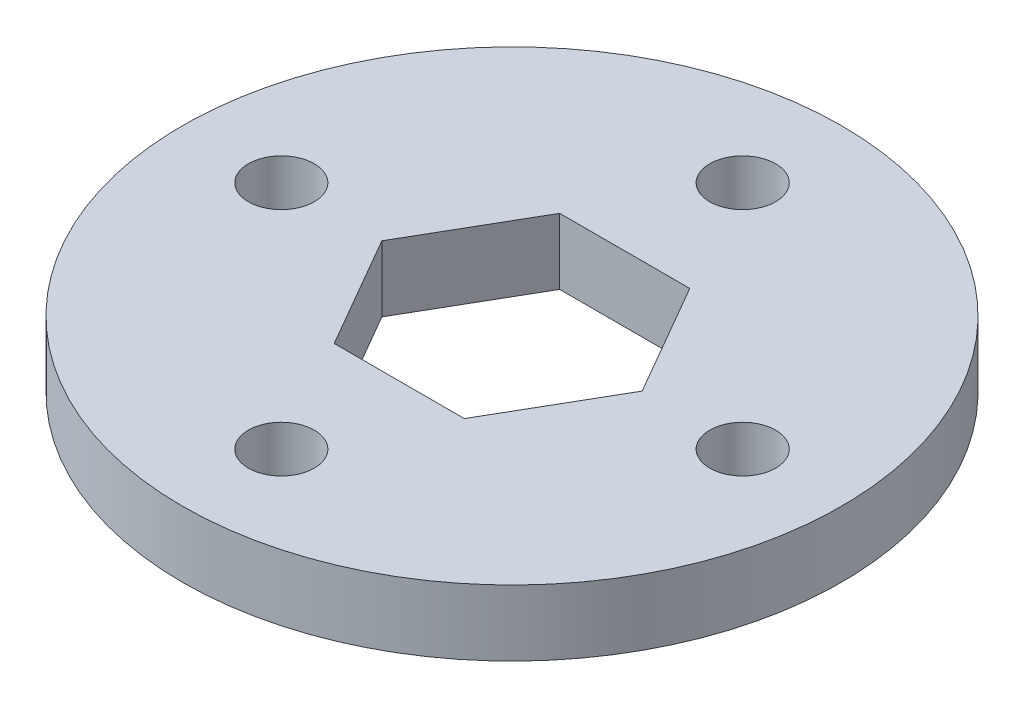
ISO-10303-21;
HEADER;
FILE_DESCRIPTION(('STEP AP214'),'2;1');
FILE_NAME('part.step','',(''),(''),'','','');
FILE_SCHEMA(('AUTOMOTIVE_DESIGN { 1 0 10303 214 1 1 1 1 }'));
ENDSEC;
DATA;
#1=APPLICATION_CONTEXT('core data for automotive mechanical design processes');
#2=APPLICATION_PROTOCOL_DEFINITION('international standard','automotive_design',2000,#1);
#3=PRODUCT_CONTEXT('',#1,'mechanical');
#4=PRODUCT('Part','Part','',(#3));
#5=PRODUCT_RELATED_PRODUCT_CATEGORY('part','',(#4));
#6=PRODUCT_DEFINITION_FORMATION('','',#4);
#7=PRODUCT_DEFINITION_CONTEXT('part definition',#1,'design');
#8=PRODUCT_DEFINITION('design','',#6,#7);
#9=PRODUCT_DEFINITION_SHAPE('','',#8);
#10=(LENGTH_UNIT() NAMED_UNIT(*) SI_UNIT(.MILLI.,.METRE.));
#11=(NAMED_UNIT(*) PLANE_ANGLE_UNIT() SI_UNIT($,.RADIAN.));
#12=(NAMED_UNIT(*) SI_UNIT($,.STERADIAN.) SOLID_ANGLE_UNIT());
#13=UNCERTAINTY_MEASURE_WITH_UNIT(LENGTH_MEASURE(1.E-05),#10,'distance_accuracy_value','');
#14=(GEOMETRIC_REPRESENTATION_CONTEXT(3) GLOBAL_UNCERTAINTY_ASSIGNED_CONTEXT((#13)) GLOBAL_UNIT_ASSIGNED_CONTEXT((#10,
#11,#12)) REPRESENTATION_CONTEXT('',''));
#15=CARTESIAN_POINT('',(0.,0.,0.));
#16=DIRECTION('',(0.,0.,1.));
#17=DIRECTION('',(1.,0.,0.));
#18=AXIS2_PLACEMENT_3D('',#15,#16,#17);
#19=CARTESIAN_POINT('',(0.,5.,0.));
#20=DIRECTION('',(0.,1.,0.));
#21=DIRECTION('',(0.,0.,1.));
#22=AXIS2_PLACEMENT_3D('',#19,#20,#21);
#23=PLANE('',#22);
#24=CARTESIAN_POINT('',(0.,5.,-17.5));
#25=DIRECTION('',(0.,1.,0.));
#26=DIRECTION('',(0.,0.,1.));
#27=AXIS2_PLACEMENT_3D('',#24,#25,#26);
#28=CIRCLE('',#27,2.5);
#29=CARTESIAN_POINT('',(0.,5.,-15.));
#30=VERTEX_POINT('',#29);
#31=EDGE_CURVE('E174',#30,#30,#28,.T.);
#32=ORIENTED_EDGE('',*,*,#31,.F.);
#33=EDGE_LOOP('',(#32));
#34=FACE_BOUND('',#33,.T.);
#35=CARTESIAN_POINT('',(17.5000000000005,5.,-4.94165217184309E-13));
#36=DIRECTION('',(0.,1.,0.));
#37=DIRECTION('',(0.,0.,1.));
#38=AXIS2_PLACEMENT_3D('',#35,#36,#37);
#39=CIRCLE('',#38,2.50000000000039);
#40=CARTESIAN_POINT('',(17.5000000000005,5.,2.49999999999989));
#41=VERTEX_POINT('',#40);
#42=EDGE_CURVE('E333',#41,#41,#39,.T.);
#43=ORIENTED_EDGE('',*,*,#42,.F.);
#44=EDGE_LOOP('',(#43));
#45=FACE_BOUND('',#44,.T.);
#46=CARTESIAN_POINT('',(9.88330434368617E-13,5.,17.5));
#47=DIRECTION('',(0.,1.,0.));
#48=DIRECTION('',(0.,0.,1.));
#49=AXIS2_PLACEMENT_3D('',#46,#47,#48);
#50=CIRCLE('',#49,2.50000000000106);
#51=CARTESIAN_POINT('',(9.88330434368617E-13,5.,20.0000000000011));
#52=VERTEX_POINT('',#51);
#53=EDGE_CURVE('E239',#52,#52,#50,.T.);
#54=ORIENTED_EDGE('',*,*,#53,.F.);
#55=EDGE_LOOP('',(#54));
#56=FACE_BOUND('',#55,.T.);
#57=CARTESIAN_POINT('',(-17.4999999999995,5.,4.96308349082816E-13));
#58=DIRECTION('',(0.,1.,0.));
#59=DIRECTION('',(0.,0.,1.));
#60=AXIS2_PLACEMENT_3D('',#57,#58,#59);
#61=CIRCLE('',#60,2.50000000000079);
#62=CARTESIAN_POINT('',(-17.4999999999995,5.,2.50000000000129));
#63=VERTEX_POINT('',#62);
#64=EDGE_CURVE('E334',#63,#63,#61,.T.);
#65=ORIENTED_EDGE('',*,*,#64,.F.);
#66=EDGE_LOOP('',(#65));
#67=FACE_BOUND('',#66,.T.);
#68=CARTESIAN_POINT('',(0.,5.,0.));
#69=DIRECTION('',(0.,1.,0.));
#70=DIRECTION('',(0.,0.,1.));
#71=AXIS2_PLACEMENT_3D('',#68,#69,#70);
#72=CIRCLE('',#71,25.);
#73=CARTESIAN_POINT('',(0.,5.,25.));
#74=VERTEX_POINT('',#73);
#75=EDGE_CURVE('E11',#74,#74,#72,.T.);
#76=ORIENTED_EDGE('',*,*,#75,.T.);
#77=EDGE_LOOP('',(#76));
#78=FACE_BOUND('',#77,.T.);
#79=DIRECTION('',(0.5,0.,0.866025403784438));
#80=VECTOR('',#79,1.);
#81=CARTESIAN_POINT('',(-9.87268960314261,5.,0.));
#82=LINE('',#81,#80);
#83=CARTESIAN_POINT('',(-9.87268960314261,5.,0.));
#84=VERTEX_POINT('',#83);
#85=CARTESIAN_POINT('',(-4.9363448015713,5.,8.55000000000001));
#86=VERTEX_POINT('',#85);
#87=EDGE_CURVE('E106',#84,#86,#82,.T.);
#88=ORIENTED_EDGE('',*,*,#87,.F.);
#89=DIRECTION('',(-0.5,0.,0.866025403784439));
#90=VECTOR('',#89,1.);
#91=CARTESIAN_POINT('',(-4.9363448015713,5.,-8.55000000000001));
#92=LINE('',#91,#90);
#93=CARTESIAN_POINT('',(-4.9363448015713,5.,-8.55000000000001));
#94=VERTEX_POINT('',#93);
#95=EDGE_CURVE('E97',#94,#84,#92,.T.);
#96=ORIENTED_EDGE('',*,*,#95,.F.);
#97=DIRECTION('',(-1.,0.,0.));
#98=VECTOR('',#97,1.);
#99=CARTESIAN_POINT('',(4.93634480157129,5.,-8.55000000000001));
#100=LINE('',#99,#98);
#101=CARTESIAN_POINT('',(4.93634480157129,5.,-8.55000000000001));
#102=VERTEX_POINT('',#101);
#103=EDGE_CURVE('E132',#102,#94,#100,.T.);
#104=ORIENTED_EDGE('',*,*,#103,.F.);
#105=DIRECTION('',(-0.5,0.,-0.866025403784439));
#106=VECTOR('',#105,1.);
#107=CARTESIAN_POINT('',(9.8726896031426,5.,0.));
#108=LINE('',#107,#106);
#109=CARTESIAN_POINT('',(9.8726896031426,5.,0.));
#110=VERTEX_POINT('',#109);
#111=EDGE_CURVE('E129',#110,#102,#108,.T.);
#112=ORIENTED_EDGE('',*,*,#111,.F.);
#113=DIRECTION('',(0.5,0.,-0.866025403784439));
#114=VECTOR('',#113,1.);
#115=CARTESIAN_POINT('',(4.93634480157129,5.,8.55000000000001));
#116=LINE('',#115,#114);
#117=CARTESIAN_POINT('',(4.93634480157129,5.,8.55000000000001));
#118=VERTEX_POINT('',#117);
#119=EDGE_CURVE('E123',#118,#110,#116,.T.);
#120=ORIENTED_EDGE('',*,*,#119,.F.);
#121=DIRECTION('',(1.,0.,0.));
#122=VECTOR('',#121,1.);
#123=CARTESIAN_POINT('',(-4.9363448015713,5.,8.55000000000001));
#124=LINE('',#123,#122);
#125=EDGE_CURVE('E119',#86,#118,#124,.T.);
#126=ORIENTED_EDGE('',*,*,#125,.F.);
#127=EDGE_LOOP('',(#88,#96,#104,#112,#120,#126));
#128=FACE_BOUND('',#127,.T.);
#129=ADVANCED_FACE('F41',(#34,#45,#56,#67,#78,#128),#23,.T.);
#130=CARTESIAN_POINT('',(0.,0.,0.));
#131=DIRECTION('',(0.,1.,0.));
#132=DIRECTION('',(0.,0.,1.));
#133=AXIS2_PLACEMENT_3D('',#130,#131,#132);
#134=PLANE('',#133);
#135=CARTESIAN_POINT('',(0.,0.,-17.5));
#136=DIRECTION('',(0.,1.,0.));
#137=DIRECTION('',(0.,0.,1.));
#138=AXIS2_PLACEMENT_3D('',#135,#136,#137);
#139=CIRCLE('',#138,2.5);
#140=CARTESIAN_POINT('',(0.,0.,-15.));
#141=VERTEX_POINT('',#140);
#142=EDGE_CURVE('E45',#141,#141,#139,.T.);
#143=ORIENTED_EDGE('',*,*,#142,.T.);
#144=EDGE_LOOP('',(#143));
#145=FACE_BOUND('',#144,.T.);
#146=CARTESIAN_POINT('',(17.5000000000005,0.,-4.94165217184309E-13));
#147=DIRECTION('',(0.,1.,0.));
#148=DIRECTION('',(0.,0.,1.));
#149=AXIS2_PLACEMENT_3D('',#146,#147,#148);
#150=CIRCLE('',#149,2.50000000000039);
#151=CARTESIAN_POINT('',(17.5000000000005,0.,2.49999999999989));
#152=VERTEX_POINT('',#151);
#153=EDGE_CURVE('E177',#152,#152,#150,.T.);
#154=ORIENTED_EDGE('',*,*,#153,.T.);
#155=EDGE_LOOP('',(#154));
#156=FACE_BOUND('',#155,.T.);
#157=CARTESIAN_POINT('',(9.88330434368617E-13,0.,17.5));
#158=DIRECTION('',(0.,1.,0.));
#159=DIRECTION('',(0.,0.,1.));
#160=AXIS2_PLACEMENT_3D('',#157,#158,#159);
#161=CIRCLE('',#160,2.50000000000106);
#162=CARTESIAN_POINT('',(9.88330434368617E-13,0.,20.0000000000011));
#163=VERTEX_POINT('',#162);
#164=EDGE_CURVE('E173',#163,#163,#161,.T.);
#165=ORIENTED_EDGE('',*,*,#164,.T.);
#166=EDGE_LOOP('',(#165));
#167=FACE_BOUND('',#166,.T.);
#168=CARTESIAN_POINT('',(-17.4999999999995,0.,4.96308349082816E-13));
#169=DIRECTION('',(0.,1.,0.));
#170=DIRECTION('',(0.,0.,1.));
#171=AXIS2_PLACEMENT_3D('',#168,#169,#170);
#172=CIRCLE('',#171,2.50000000000079);
#173=CARTESIAN_POINT('',(-17.4999999999995,0.,2.50000000000129));
#174=VERTEX_POINT('',#173);
#175=EDGE_CURVE('E169',#174,#174,#172,.T.);
#176=ORIENTED_EDGE('',*,*,#175,.T.);
#177=EDGE_LOOP('',(#176));
#178=FACE_BOUND('',#177,.T.);
#179=CARTESIAN_POINT('',(0.,0.,0.));
#180=DIRECTION('',(0.,1.,0.));
#181=DIRECTION('',(0.,0.,1.));
#182=AXIS2_PLACEMENT_3D('',#179,#180,#181);
#183=CIRCLE('',#182,25.);
#184=CARTESIAN_POINT('',(0.,0.,25.));
#185=VERTEX_POINT('',#184);
#186=EDGE_CURVE('E51',#185,#185,#183,.T.);
#187=ORIENTED_EDGE('',*,*,#186,.F.);
#188=EDGE_LOOP('',(#187));
#189=FACE_BOUND('',#188,.T.);
#190=DIRECTION('',(-0.5,0.,0.866025403784439));
#191=VECTOR('',#190,1.);
#192=CARTESIAN_POINT('',(-4.9363448015713,0.,-8.55000000000001));
#193=LINE('',#192,#191);
#194=CARTESIAN_POINT('',(-4.9363448015713,0.,-8.55000000000001));
#195=VERTEX_POINT('',#194);
#196=CARTESIAN_POINT('',(-9.87268960314261,0.,0.));
#197=VERTEX_POINT('',#196);
#198=EDGE_CURVE('E67',#195,#197,#193,.T.);
#199=ORIENTED_EDGE('',*,*,#198,.T.);
#200=DIRECTION('',(0.5,0.,0.866025403784438));
#201=VECTOR('',#200,1.);
#202=CARTESIAN_POINT('',(-9.87268960314261,0.,0.));
#203=LINE('',#202,#201);
#204=CARTESIAN_POINT('',(-4.9363448015713,0.,8.55000000000001));
#205=VERTEX_POINT('',#204);
#206=EDGE_CURVE('E113',#197,#205,#203,.T.);
#207=ORIENTED_EDGE('',*,*,#206,.T.);
#208=DIRECTION('',(1.,0.,0.));
#209=VECTOR('',#208,1.);
#210=CARTESIAN_POINT('',(-4.9363448015713,0.,8.55000000000001));
#211=LINE('',#210,#209);
#212=CARTESIAN_POINT('',(4.93634480157129,0.,8.55000000000001));
#213=VERTEX_POINT('',#212);
#214=EDGE_CURVE('E139',#205,#213,#211,.T.);
#215=ORIENTED_EDGE('',*,*,#214,.T.);
#216=DIRECTION('',(0.5,0.,-0.866025403784439));
#217=VECTOR('',#216,1.);
#218=CARTESIAN_POINT('',(4.93634480157129,0.,8.55000000000001));
#219=LINE('',#218,#217);
#220=CARTESIAN_POINT('',(9.8726896031426,0.,0.));
#221=VERTEX_POINT('',#220);
#222=EDGE_CURVE('E143',#213,#221,#219,.T.);
#223=ORIENTED_EDGE('',*,*,#222,.T.);
#224=DIRECTION('',(-0.5,0.,-0.866025403784439));
#225=VECTOR('',#224,1.);
#226=CARTESIAN_POINT('',(9.8726896031426,0.,0.));
#227=LINE('',#226,#225);
#228=CARTESIAN_POINT('',(4.93634480157129,0.,-8.55000000000001));
#229=VERTEX_POINT('',#228);
#230=EDGE_CURVE('E147',#221,#229,#227,.T.);
#231=ORIENTED_EDGE('',*,*,#230,.T.);
#232=DIRECTION('',(-1.,0.,0.));
#233=VECTOR('',#232,1.);
#234=CARTESIAN_POINT('',(4.93634480157129,0.,-8.55000000000001));
#235=LINE('',#234,#233);
#236=EDGE_CURVE('E107',#229,#195,#235,.T.);
#237=ORIENTED_EDGE('',*,*,#236,.T.);
#238=EDGE_LOOP('',(#199,#207,#215,#223,#231,#237));
#239=FACE_BOUND('',#238,.T.);
#240=ADVANCED_FACE('F186',(#145,#156,#167,#178,#189,#239),#134,.F.);
#241=CARTESIAN_POINT('',(0.,5.,0.));
#242=DIRECTION('',(0.,-1.,0.));
#243=DIRECTION('',(0.,0.,-1.));
#244=AXIS2_PLACEMENT_3D('',#241,#242,#243);
#245=CYLINDRICAL_SURFACE('',#244,25.);
#246=ORIENTED_EDGE('',*,*,#75,.F.);
#247=EDGE_LOOP('',(#246));
#248=FACE_BOUND('',#247,.T.);
#249=ORIENTED_EDGE('',*,*,#186,.T.);
#250=EDGE_LOOP('',(#249));
#251=FACE_BOUND('',#250,.T.);
#252=ADVANCED_FACE('F43',(#248,#251),#245,.T.);
#253=CARTESIAN_POINT('',(-4.9363448015713,5.,-8.55000000000001));
#254=DIRECTION('',(0.866025403784439,0.,0.5));
#255=DIRECTION('',(0.5,0.,-0.866025403784439));
#256=AXIS2_PLACEMENT_3D('',#253,#254,#255);
#257=PLANE('',#256);
#258=ORIENTED_EDGE('',*,*,#198,.F.);
#259=DIRECTION('',(0.,-1.,0.));
#260=VECTOR('',#259,1.);
#261=CARTESIAN_POINT('',(-4.9363448015713,5.,-8.55000000000001));
#262=LINE('',#261,#260);
#263=EDGE_CURVE('E101',#94,#195,#262,.T.);
#264=ORIENTED_EDGE('',*,*,#263,.F.);
#265=ORIENTED_EDGE('',*,*,#95,.T.);
#266=DIRECTION('',(0.,-1.,0.));
#267=VECTOR('',#266,1.);
#268=CARTESIAN_POINT('',(-9.87268960314261,5.,0.));
#269=LINE('',#268,#267);
#270=EDGE_CURVE('E100',#84,#197,#269,.T.);
#271=ORIENTED_EDGE('',*,*,#270,.T.);
#272=EDGE_LOOP('',(#258,#264,#265,#271));
#273=FACE_BOUND('',#272,.T.);
#274=ADVANCED_FACE('F99',(#273),#257,.T.);
#275=CARTESIAN_POINT('',(-9.87268960314261,5.,0.));
#276=DIRECTION('',(0.866025403784439,0.,-0.5));
#277=DIRECTION('',(-0.5,0.,-0.866025403784439));
#278=AXIS2_PLACEMENT_3D('',#275,#276,#277);
#279=PLANE('',#278);
#280=ORIENTED_EDGE('',*,*,#206,.F.);
#281=ORIENTED_EDGE('',*,*,#270,.F.);
#282=ORIENTED_EDGE('',*,*,#87,.T.);
#283=DIRECTION('',(0.,-1.,0.));
#284=VECTOR('',#283,1.);
#285=CARTESIAN_POINT('',(-4.9363448015713,5.,8.55000000000001));
#286=LINE('',#285,#284);
#287=EDGE_CURVE('E115',#86,#205,#286,.T.);
#288=ORIENTED_EDGE('',*,*,#287,.T.);
#289=EDGE_LOOP('',(#280,#281,#282,#288));
#290=FACE_BOUND('',#289,.T.);
#291=ADVANCED_FACE('F110',(#290),#279,.T.);
#292=CARTESIAN_POINT('',(-4.9363448015713,5.,8.55000000000001));
#293=DIRECTION('',(0.,0.,-1.));
#294=DIRECTION('',(-1.,0.,0.));
#295=AXIS2_PLACEMENT_3D('',#292,#293,#294);
#296=PLANE('',#295);
#297=ORIENTED_EDGE('',*,*,#214,.F.);
#298=ORIENTED_EDGE('',*,*,#287,.F.);
#299=ORIENTED_EDGE('',*,*,#125,.T.);
#300=DIRECTION('',(0.,-1.,0.));
#301=VECTOR('',#300,1.);
#302=CARTESIAN_POINT('',(4.93634480157129,5.,8.55000000000001));
#303=LINE('',#302,#301);
#304=EDGE_CURVE('E161',#118,#213,#303,.T.);
#305=ORIENTED_EDGE('',*,*,#304,.T.);
#306=EDGE_LOOP('',(#297,#298,#299,#305));
#307=FACE_BOUND('',#306,.T.);
#308=ADVANCED_FACE('F213',(#307),#296,.T.);
#309=CARTESIAN_POINT('',(4.93634480157129,5.,8.55000000000001));
#310=DIRECTION('',(-0.866025403784439,0.,-0.5));
#311=DIRECTION('',(-0.5,0.,0.866025403784439));
#312=AXIS2_PLACEMENT_3D('',#309,#310,#311);
#313=PLANE('',#312);
#314=ORIENTED_EDGE('',*,*,#222,.F.);
#315=ORIENTED_EDGE('',*,*,#304,.F.);
#316=ORIENTED_EDGE('',*,*,#119,.T.);
#317=DIRECTION('',(0.,-1.,0.));
#318=VECTOR('',#317,1.);
#319=CARTESIAN_POINT('',(9.8726896031426,5.,0.));
#320=LINE('',#319,#318);
#321=EDGE_CURVE('E158',#110,#221,#320,.T.);
#322=ORIENTED_EDGE('',*,*,#321,.T.);
#323=EDGE_LOOP('',(#314,#315,#316,#322));
#324=FACE_BOUND('',#323,.T.);
#325=ADVANCED_FACE('F216',(#324),#313,.T.);
#326=CARTESIAN_POINT('',(9.8726896031426,5.,0.));
#327=DIRECTION('',(-0.866025403784439,0.,0.5));
#328=DIRECTION('',(0.5,0.,0.866025403784439));
#329=AXIS2_PLACEMENT_3D('',#326,#327,#328);
#330=PLANE('',#329);
#331=ORIENTED_EDGE('',*,*,#230,.F.);
#332=ORIENTED_EDGE('',*,*,#321,.F.);
#333=ORIENTED_EDGE('',*,*,#111,.T.);
#334=DIRECTION('',(0.,-1.,0.));
#335=VECTOR('',#334,1.);
#336=CARTESIAN_POINT('',(4.93634480157129,5.,-8.55000000000001));
#337=LINE('',#336,#335);
#338=EDGE_CURVE('E59',#102,#229,#337,.T.);
#339=ORIENTED_EDGE('',*,*,#338,.T.);
#340=EDGE_LOOP('',(#331,#332,#333,#339));
#341=FACE_BOUND('',#340,.T.);
#342=ADVANCED_FACE('F220',(#341),#330,.T.);
#343=CARTESIAN_POINT('',(4.93634480157129,5.,-8.55000000000001));
#344=DIRECTION('',(0.,0.,1.));
#345=DIRECTION('',(1.,0.,0.));
#346=AXIS2_PLACEMENT_3D('',#343,#344,#345);
#347=PLANE('',#346);
#348=ORIENTED_EDGE('',*,*,#236,.F.);
#349=ORIENTED_EDGE('',*,*,#338,.F.);
#350=ORIENTED_EDGE('',*,*,#103,.T.);
#351=ORIENTED_EDGE('',*,*,#263,.T.);
#352=EDGE_LOOP('',(#348,#349,#350,#351));
#353=FACE_BOUND('',#352,.T.);
#354=ADVANCED_FACE('F224',(#353),#347,.T.);
#355=CARTESIAN_POINT('',(-17.4999999999995,-13.,4.96308349082816E-13));
#356=DIRECTION('',(0.,1.,0.));
#357=DIRECTION('',(0.,0.,1.));
#358=AXIS2_PLACEMENT_3D('',#355,#356,#357);
#359=CYLINDRICAL_SURFACE('',#358,2.50000000000079);
#360=ORIENTED_EDGE('',*,*,#64,.T.);
#361=EDGE_LOOP('',(#360));
#362=FACE_BOUND('',#361,.T.);
#363=ORIENTED_EDGE('',*,*,#175,.F.);
#364=EDGE_LOOP('',(#363));
#365=FACE_BOUND('',#364,.T.);
#366=ADVANCED_FACE('F228',(#362,#365),#359,.F.);
#367=CARTESIAN_POINT('',(9.88330434368617E-13,-13.,17.5));
#368=DIRECTION('',(0.,1.,0.));
#369=DIRECTION('',(0.,0.,1.));
#370=AXIS2_PLACEMENT_3D('',#367,#368,#369);
#371=CYLINDRICAL_SURFACE('',#370,2.50000000000106);
#372=ORIENTED_EDGE('',*,*,#53,.T.);
#373=EDGE_LOOP('',(#372));
#374=FACE_BOUND('',#373,.T.);
#375=ORIENTED_EDGE('',*,*,#164,.F.);
#376=EDGE_LOOP('',(#375));
#377=FACE_BOUND('',#376,.T.);
#378=ADVANCED_FACE('F196',(#374,#377),#371,.F.);
#379=CARTESIAN_POINT('',(17.5000000000005,-13.,-4.94165217184309E-13));
#380=DIRECTION('',(0.,1.,0.));
#381=DIRECTION('',(0.,0.,1.));
#382=AXIS2_PLACEMENT_3D('',#379,#380,#381);
#383=CYLINDRICAL_SURFACE('',#382,2.50000000000039);
#384=ORIENTED_EDGE('',*,*,#42,.T.);
#385=EDGE_LOOP('',(#384));
#386=FACE_BOUND('',#385,.T.);
#387=ORIENTED_EDGE('',*,*,#153,.F.);
#388=EDGE_LOOP('',(#387));
#389=FACE_BOUND('',#388,.T.);
#390=ADVANCED_FACE('F190',(#386,#389),#383,.F.);
#391=CARTESIAN_POINT('',(0.,-13.,-17.5));
#392=DIRECTION('',(0.,1.,0.));
#393=DIRECTION('',(0.,0.,1.));
#394=AXIS2_PLACEMENT_3D('',#391,#392,#393);
#395=CYLINDRICAL_SURFACE('',#394,2.5);
#396=ORIENTED_EDGE('',*,*,#31,.T.);
#397=EDGE_LOOP('',(#396));
#398=FACE_BOUND('',#397,.T.);
#399=ORIENTED_EDGE('',*,*,#142,.F.);
#400=EDGE_LOOP('',(#399));
#401=FACE_BOUND('',#400,.T.);
#402=ADVANCED_FACE('F188',(#398,#401),#395,.F.);
#403=CLOSED_SHELL('',(#129,#240,#252,#274,#291,#308,#325,#342,#354,#366,#378,#390,#402));
#404=MANIFOLD_SOLID_BREP('B2',#403);
#405=ADVANCED_BREP_SHAPE_REPRESENTATION('',(#18,#404),#14);
#406=SHAPE_DEFINITION_REPRESENTATION(#9,#405);
ENDSEC;
END-ISO-10303-21;
